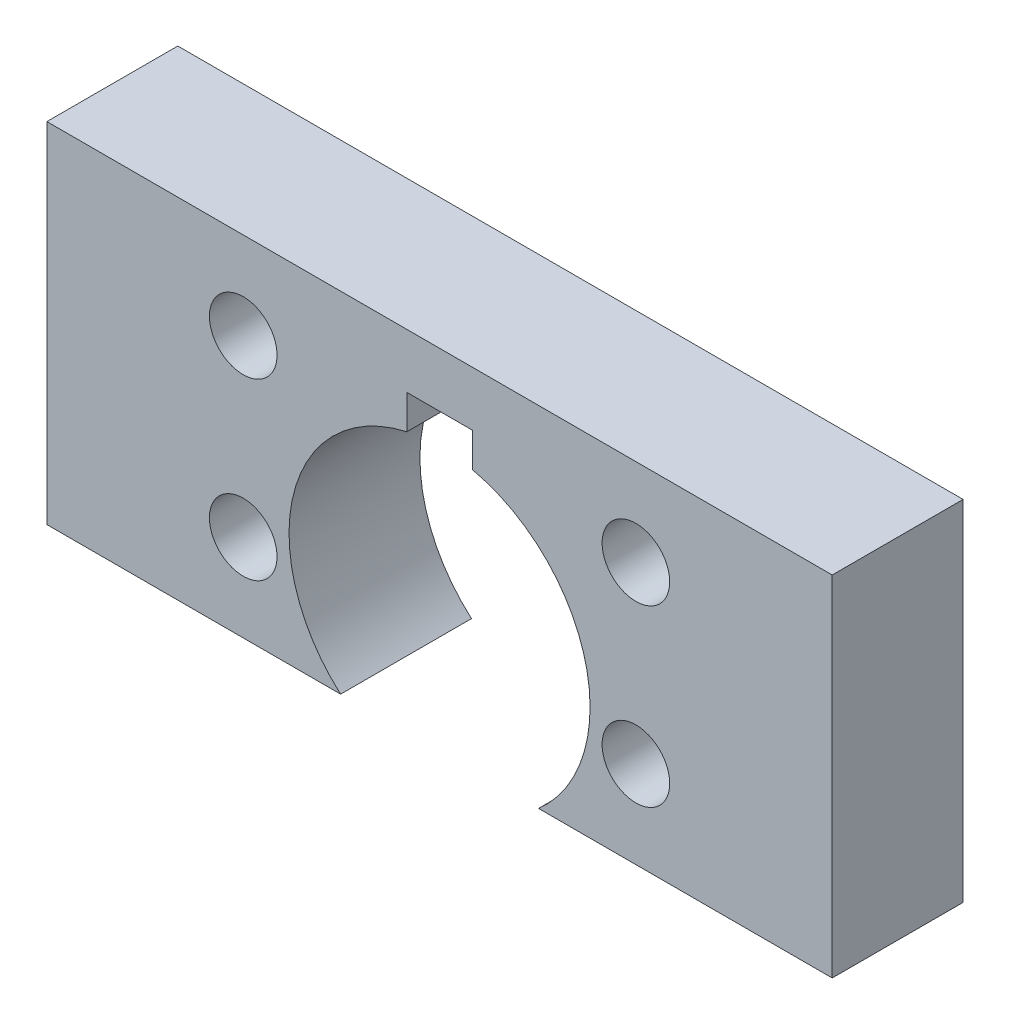
ISO-10303-21;
HEADER;
FILE_DESCRIPTION(('STEP AP214'),'2;1');
FILE_NAME('part.step','',(''),(''),'','','');
FILE_SCHEMA(('AUTOMOTIVE_DESIGN { 1 0 10303 214 1 1 1 1 }'));
ENDSEC;
DATA;
#1=APPLICATION_CONTEXT('core data for automotive mechanical design processes');
#2=APPLICATION_PROTOCOL_DEFINITION('international standard','automotive_design',2000,#1);
#3=PRODUCT_CONTEXT('',#1,'mechanical');
#4=PRODUCT('Part','Part','',(#3));
#5=PRODUCT_RELATED_PRODUCT_CATEGORY('part','',(#4));
#6=PRODUCT_DEFINITION_FORMATION('','',#4);
#7=PRODUCT_DEFINITION_CONTEXT('part definition',#1,'design');
#8=PRODUCT_DEFINITION('design','',#6,#7);
#9=PRODUCT_DEFINITION_SHAPE('','',#8);
#10=(LENGTH_UNIT() NAMED_UNIT(*) SI_UNIT(.MILLI.,.METRE.));
#11=(NAMED_UNIT(*) PLANE_ANGLE_UNIT() SI_UNIT($,.RADIAN.));
#12=(NAMED_UNIT(*) SI_UNIT($,.STERADIAN.) SOLID_ANGLE_UNIT());
#13=UNCERTAINTY_MEASURE_WITH_UNIT(LENGTH_MEASURE(1.E-05),#10,'distance_accuracy_value','');
#14=(GEOMETRIC_REPRESENTATION_CONTEXT(3) GLOBAL_UNCERTAINTY_ASSIGNED_CONTEXT((#13)) GLOBAL_UNIT_ASSIGNED_CONTEXT((#10,
#11,#12)) REPRESENTATION_CONTEXT('',''));
#15=CARTESIAN_POINT('',(0.,0.,0.));
#16=DIRECTION('',(0.,0.,1.));
#17=DIRECTION('',(1.,0.,0.));
#18=AXIS2_PLACEMENT_3D('',#15,#16,#17);
#19=CARTESIAN_POINT('',(71.5029820344726,-16.,-6.));
#20=DIRECTION('',(0.,-1.,0.));
#21=DIRECTION('',(0.,0.,-1.));
#22=AXIS2_PLACEMENT_3D('',#19,#20,#21);
#23=PLANE('',#22);
#24=DIRECTION('',(0.,0.,1.));
#25=VECTOR('',#24,1.);
#26=CARTESIAN_POINT('',(58.038398222652,-16.,-6.));
#27=LINE('',#26,#25);
#28=CARTESIAN_POINT('',(58.038398222652,-16.,-6.));
#29=VERTEX_POINT('',#28);
#30=CARTESIAN_POINT('',(58.038398222652,-16.,0.));
#31=VERTEX_POINT('',#30);
#32=EDGE_CURVE('E53',#29,#31,#27,.T.);
#33=ORIENTED_EDGE('',*,*,#32,.F.);
#34=DIRECTION('',(1.,0.,0.));
#35=VECTOR('',#34,1.);
#36=CARTESIAN_POINT('',(71.5029820344726,-16.,-6.));
#37=LINE('',#36,#35);
#38=CARTESIAN_POINT('',(71.5029820344726,-16.,-6.));
#39=VERTEX_POINT('',#38);
#40=EDGE_CURVE('E60',#29,#39,#37,.T.);
#41=ORIENTED_EDGE('',*,*,#40,.T.);
#42=DIRECTION('',(0.,0.,1.));
#43=VECTOR('',#42,1.);
#44=CARTESIAN_POINT('',(71.5029820344726,-16.,-6.));
#45=LINE('',#44,#43);
#46=CARTESIAN_POINT('',(71.5029820344726,-16.,0.));
#47=VERTEX_POINT('',#46);
#48=EDGE_CURVE('E46',#39,#47,#45,.T.);
#49=ORIENTED_EDGE('',*,*,#48,.T.);
#50=DIRECTION('',(1.,0.,0.));
#51=VECTOR('',#50,1.);
#52=CARTESIAN_POINT('',(71.5029820344726,-16.,0.));
#53=LINE('',#52,#51);
#54=EDGE_CURVE('E83',#31,#47,#53,.T.);
#55=ORIENTED_EDGE('',*,*,#54,.F.);
#56=EDGE_LOOP('',(#33,#41,#49,#55));
#57=FACE_BOUND('',#56,.T.);
#58=ADVANCED_FACE('F38',(#57),#23,.T.);
#59=DIRECTION('',(0.,0.,1.));
#60=VECTOR('',#59,1.);
#61=CARTESIAN_POINT('',(48.9675658462931,-16.,-6.));
#62=LINE('',#61,#60);
#63=CARTESIAN_POINT('',(48.9675658462931,-16.,0.));
#64=VERTEX_POINT('',#63);
#65=CARTESIAN_POINT('',(48.9675658462931,-16.,-6.));
#66=VERTEX_POINT('',#65);
#67=EDGE_CURVE('E174',#64,#66,#62,.F.);
#68=ORIENTED_EDGE('',*,*,#67,.F.);
#69=CARTESIAN_POINT('',(35.5029820344726,-16.,0.));
#70=VERTEX_POINT('',#69);
#71=EDGE_CURVE('E181',#70,#64,#53,.T.);
#72=ORIENTED_EDGE('',*,*,#71,.F.);
#73=DIRECTION('',(0.,0.,1.));
#74=VECTOR('',#73,1.);
#75=CARTESIAN_POINT('',(35.5029820344726,-16.,-6.));
#76=LINE('',#75,#74);
#77=CARTESIAN_POINT('',(35.5029820344726,-16.,-6.));
#78=VERTEX_POINT('',#77);
#79=EDGE_CURVE('E202',#78,#70,#76,.T.);
#80=ORIENTED_EDGE('',*,*,#79,.F.);
#81=EDGE_CURVE('E187',#78,#66,#37,.T.);
#82=ORIENTED_EDGE('',*,*,#81,.T.);
#83=EDGE_LOOP('',(#68,#72,#80,#82));
#84=FACE_BOUND('',#83,.T.);
#85=ADVANCED_FACE('F230',(#84),#23,.T.);
#86=CARTESIAN_POINT('',(71.5029820344726,0.,-6.));
#87=DIRECTION('',(1.,0.,0.));
#88=DIRECTION('',(0.,0.,-1.));
#89=AXIS2_PLACEMENT_3D('',#86,#87,#88);
#90=PLANE('',#89);
#91=DIRECTION('',(0.,1.,0.));
#92=VECTOR('',#91,1.);
#93=CARTESIAN_POINT('',(71.5029820344726,0.,0.));
#94=LINE('',#93,#92);
#95=CARTESIAN_POINT('',(71.5029820344726,0.,0.));
#96=VERTEX_POINT('',#95);
#97=EDGE_CURVE('E176',#47,#96,#94,.T.);
#98=ORIENTED_EDGE('',*,*,#97,.F.);
#99=ORIENTED_EDGE('',*,*,#48,.F.);
#100=DIRECTION('',(0.,1.,0.));
#101=VECTOR('',#100,1.);
#102=CARTESIAN_POINT('',(71.5029820344726,0.,-6.));
#103=LINE('',#102,#101);
#104=CARTESIAN_POINT('',(71.5029820344726,0.,-6.));
#105=VERTEX_POINT('',#104);
#106=EDGE_CURVE('E177',#39,#105,#103,.T.);
#107=ORIENTED_EDGE('',*,*,#106,.T.);
#108=DIRECTION('',(0.,0.,1.));
#109=VECTOR('',#108,1.);
#110=CARTESIAN_POINT('',(71.5029820344726,0.,-6.));
#111=LINE('',#110,#109);
#112=EDGE_CURVE('E89',#105,#96,#111,.T.);
#113=ORIENTED_EDGE('',*,*,#112,.T.);
#114=EDGE_LOOP('',(#98,#99,#107,#113));
#115=FACE_BOUND('',#114,.T.);
#116=ADVANCED_FACE('F40',(#115),#90,.T.);
#117=CARTESIAN_POINT('',(35.5029820344726,0.,-6.));
#118=DIRECTION('',(-1.,0.,0.));
#119=DIRECTION('',(0.,0.,1.));
#120=AXIS2_PLACEMENT_3D('',#117,#118,#119);
#121=PLANE('',#120);
#122=DIRECTION('',(0.,-1.,0.));
#123=VECTOR('',#122,1.);
#124=CARTESIAN_POINT('',(35.5029820344726,0.,0.));
#125=LINE('',#124,#123);
#126=CARTESIAN_POINT('',(35.5029820344726,0.,0.));
#127=VERTEX_POINT('',#126);
#128=EDGE_CURVE('E196',#127,#70,#125,.T.);
#129=ORIENTED_EDGE('',*,*,#128,.F.);
#130=DIRECTION('',(0.,0.,1.));
#131=VECTOR('',#130,1.);
#132=CARTESIAN_POINT('',(35.5029820344726,0.,-6.));
#133=LINE('',#132,#131);
#134=CARTESIAN_POINT('',(35.5029820344726,0.,-6.));
#135=VERTEX_POINT('',#134);
#136=EDGE_CURVE('E204',#135,#127,#133,.T.);
#137=ORIENTED_EDGE('',*,*,#136,.F.);
#138=DIRECTION('',(0.,-1.,0.));
#139=VECTOR('',#138,1.);
#140=CARTESIAN_POINT('',(35.5029820344726,0.,-6.));
#141=LINE('',#140,#139);
#142=EDGE_CURVE('E184',#135,#78,#141,.T.);
#143=ORIENTED_EDGE('',*,*,#142,.T.);
#144=ORIENTED_EDGE('',*,*,#79,.T.);
#145=EDGE_LOOP('',(#129,#137,#143,#144));
#146=FACE_BOUND('',#145,.T.);
#147=ADVANCED_FACE('F236',(#146),#121,.T.);
#148=CARTESIAN_POINT('',(71.5029820344726,0.,-6.));
#149=DIRECTION('',(0.,1.,0.));
#150=DIRECTION('',(-1.,0.,0.));
#151=AXIS2_PLACEMENT_3D('',#148,#149,#150);
#152=PLANE('',#151);
#153=DIRECTION('',(-1.,0.,0.));
#154=VECTOR('',#153,1.);
#155=CARTESIAN_POINT('',(71.5029820344726,0.,0.));
#156=LINE('',#155,#154);
#157=EDGE_CURVE('E192',#96,#127,#156,.T.);
#158=ORIENTED_EDGE('',*,*,#157,.F.);
#159=ORIENTED_EDGE('',*,*,#112,.F.);
#160=DIRECTION('',(-1.,0.,0.));
#161=VECTOR('',#160,1.);
#162=CARTESIAN_POINT('',(71.5029820344726,0.,-6.));
#163=LINE('',#162,#161);
#164=EDGE_CURVE('E180',#105,#135,#163,.T.);
#165=ORIENTED_EDGE('',*,*,#164,.T.);
#166=ORIENTED_EDGE('',*,*,#136,.T.);
#167=EDGE_LOOP('',(#158,#159,#165,#166));
#168=FACE_BOUND('',#167,.T.);
#169=ADVANCED_FACE('F208',(#168),#152,.T.);
#170=CARTESIAN_POINT('',(0.,0.,-6.));
#171=DIRECTION('',(0.,0.,-1.));
#172=DIRECTION('',(-1.,0.,0.));
#173=AXIS2_PLACEMENT_3D('',#170,#171,#172);
#174=PLANE('',#173);
#175=CARTESIAN_POINT('',(62.5029820345041,-11.999999999986,-6.));
#176=DIRECTION('',(0.,0.,-1.));
#177=DIRECTION('',(-1.,0.,0.));
#178=AXIS2_PLACEMENT_3D('',#175,#176,#177);
#179=CIRCLE('',#178,1.55000000002629);
#180=CARTESIAN_POINT('',(60.9529820344778,-11.999999999986,-6.));
#181=VERTEX_POINT('',#180);
#182=EDGE_CURVE('E372',#181,#181,#179,.T.);
#183=ORIENTED_EDGE('',*,*,#182,.F.);
#184=EDGE_LOOP('',(#183));
#185=FACE_BOUND('',#184,.T.);
#186=CARTESIAN_POINT('',(62.5029820345041,-3.99999999998596,-6.));
#187=DIRECTION('',(0.,0.,-1.));
#188=DIRECTION('',(-1.,0.,0.));
#189=AXIS2_PLACEMENT_3D('',#186,#187,#188);
#190=CIRCLE('',#189,1.55000000002629);
#191=CARTESIAN_POINT('',(60.9529820344778,-3.99999999998596,-6.));
#192=VERTEX_POINT('',#191);
#193=EDGE_CURVE('E374',#192,#192,#190,.T.);
#194=ORIENTED_EDGE('',*,*,#193,.F.);
#195=EDGE_LOOP('',(#194));
#196=FACE_BOUND('',#195,.T.);
#197=CARTESIAN_POINT('',(44.5029820345041,-3.99999999998596,-6.));
#198=DIRECTION('',(0.,0.,-1.));
#199=DIRECTION('',(-1.,0.,0.));
#200=AXIS2_PLACEMENT_3D('',#197,#198,#199);
#201=CIRCLE('',#200,1.55000000001517);
#202=CARTESIAN_POINT('',(42.952982034489,-3.99999999998596,-6.));
#203=VERTEX_POINT('',#202);
#204=EDGE_CURVE('E380',#203,#203,#201,.T.);
#205=ORIENTED_EDGE('',*,*,#204,.F.);
#206=EDGE_LOOP('',(#205));
#207=FACE_BOUND('',#206,.T.);
#208=CARTESIAN_POINT('',(44.5029820345041,-11.999999999986,-6.));
#209=DIRECTION('',(0.,0.,-1.));
#210=DIRECTION('',(-1.,0.,0.));
#211=AXIS2_PLACEMENT_3D('',#208,#209,#210);
#212=CIRCLE('',#211,1.5500000000263);
#213=CARTESIAN_POINT('',(42.9529820344778,-11.999999999986,-6.));
#214=VERTEX_POINT('',#213);
#215=EDGE_CURVE('E386',#214,#214,#212,.T.);
#216=ORIENTED_EDGE('',*,*,#215,.F.);
#217=EDGE_LOOP('',(#216));
#218=FACE_BOUND('',#217,.T.);
#219=CARTESIAN_POINT('',(53.5029820344726,-10.8,-6.));
#220=DIRECTION('',(0.,0.,1.));
#221=DIRECTION('',(1.,0.,0.));
#222=AXIS2_PLACEMENT_3D('',#219,#220,#221);
#223=CIRCLE('',#222,6.9);
#224=CARTESIAN_POINT('',(52.0029820344726,-4.06501670380691,-6.));
#225=VERTEX_POINT('',#224);
#226=EDGE_CURVE('E146',#225,#66,#223,.T.);
#227=ORIENTED_EDGE('',*,*,#226,.T.);
#228=ORIENTED_EDGE('',*,*,#81,.F.);
#229=ORIENTED_EDGE('',*,*,#142,.F.);
#230=ORIENTED_EDGE('',*,*,#164,.F.);
#231=ORIENTED_EDGE('',*,*,#106,.F.);
#232=ORIENTED_EDGE('',*,*,#40,.F.);
#233=CARTESIAN_POINT('',(53.5029820344726,-10.8,-6.));
#234=DIRECTION('',(0.,0.,1.));
#235=DIRECTION('',(1.,0.,0.));
#236=AXIS2_PLACEMENT_3D('',#233,#234,#235);
#237=CIRCLE('',#236,6.9);
#238=CARTESIAN_POINT('',(55.0029820344726,-4.06501670380691,-6.));
#239=VERTEX_POINT('',#238);
#240=EDGE_CURVE('E128',#29,#239,#237,.T.);
#241=ORIENTED_EDGE('',*,*,#240,.T.);
#242=DIRECTION('',(0.,1.,0.));
#243=VECTOR('',#242,1.);
#244=CARTESIAN_POINT('',(55.0029820344726,-4.06501670380691,-6.));
#245=LINE('',#244,#243);
#246=CARTESIAN_POINT('',(55.0029820344726,-2.5,-6.));
#247=VERTEX_POINT('',#246);
#248=EDGE_CURVE('E136',#239,#247,#245,.T.);
#249=ORIENTED_EDGE('',*,*,#248,.T.);
#250=DIRECTION('',(-1.,0.,0.));
#251=VECTOR('',#250,1.);
#252=CARTESIAN_POINT('',(55.0029820344726,-2.5,-6.));
#253=LINE('',#252,#251);
#254=CARTESIAN_POINT('',(52.0029820344726,-2.5,-6.));
#255=VERTEX_POINT('',#254);
#256=EDGE_CURVE('E141',#247,#255,#253,.T.);
#257=ORIENTED_EDGE('',*,*,#256,.T.);
#258=DIRECTION('',(0.,-1.,0.));
#259=VECTOR('',#258,1.);
#260=CARTESIAN_POINT('',(52.0029820344726,-4.06501670380691,-6.));
#261=LINE('',#260,#259);
#262=EDGE_CURVE('E133',#255,#225,#261,.T.);
#263=ORIENTED_EDGE('',*,*,#262,.T.);
#264=EDGE_LOOP('',(#227,#228,#229,#230,#231,#232,#241,#249,#257,#263));
#265=FACE_BOUND('',#264,.T.);
#266=ADVANCED_FACE('F144',(#185,#196,#207,#218,#265),#174,.T.);
#267=CARTESIAN_POINT('',(0.,0.,0.));
#268=DIRECTION('',(0.,0.,-1.));
#269=DIRECTION('',(-1.,0.,0.));
#270=AXIS2_PLACEMENT_3D('',#267,#268,#269);
#271=PLANE('',#270);
#272=CARTESIAN_POINT('',(62.5029820345041,-11.999999999986,0.));
#273=DIRECTION('',(0.,0.,-1.));
#274=DIRECTION('',(-1.,0.,0.));
#275=AXIS2_PLACEMENT_3D('',#272,#273,#274);
#276=CIRCLE('',#275,1.55000000002629);
#277=CARTESIAN_POINT('',(60.9529820344778,-11.999999999986,0.));
#278=VERTEX_POINT('',#277);
#279=EDGE_CURVE('E369',#278,#278,#276,.T.);
#280=ORIENTED_EDGE('',*,*,#279,.T.);
#281=EDGE_LOOP('',(#280));
#282=FACE_BOUND('',#281,.T.);
#283=CARTESIAN_POINT('',(62.5029820345041,-3.99999999998596,0.));
#284=DIRECTION('',(0.,0.,-1.));
#285=DIRECTION('',(-1.,0.,0.));
#286=AXIS2_PLACEMENT_3D('',#283,#284,#285);
#287=CIRCLE('',#286,1.55000000002629);
#288=CARTESIAN_POINT('',(60.9529820344778,-3.99999999998596,0.));
#289=VERTEX_POINT('',#288);
#290=EDGE_CURVE('E377',#289,#289,#287,.T.);
#291=ORIENTED_EDGE('',*,*,#290,.T.);
#292=EDGE_LOOP('',(#291));
#293=FACE_BOUND('',#292,.T.);
#294=CARTESIAN_POINT('',(44.5029820345041,-3.99999999998596,0.));
#295=DIRECTION('',(0.,0.,-1.));
#296=DIRECTION('',(-1.,0.,0.));
#297=AXIS2_PLACEMENT_3D('',#294,#295,#296);
#298=CIRCLE('',#297,1.55000000001517);
#299=CARTESIAN_POINT('',(42.952982034489,-3.99999999998596,0.));
#300=VERTEX_POINT('',#299);
#301=EDGE_CURVE('E383',#300,#300,#298,.T.);
#302=ORIENTED_EDGE('',*,*,#301,.T.);
#303=EDGE_LOOP('',(#302));
#304=FACE_BOUND('',#303,.T.);
#305=CARTESIAN_POINT('',(44.5029820345041,-11.999999999986,0.));
#306=DIRECTION('',(0.,0.,-1.));
#307=DIRECTION('',(-1.,0.,0.));
#308=AXIS2_PLACEMENT_3D('',#305,#306,#307);
#309=CIRCLE('',#308,1.5500000000263);
#310=CARTESIAN_POINT('',(42.9529820344778,-11.999999999986,0.));
#311=VERTEX_POINT('',#310);
#312=EDGE_CURVE('E158',#311,#311,#309,.T.);
#313=ORIENTED_EDGE('',*,*,#312,.T.);
#314=EDGE_LOOP('',(#313));
#315=FACE_BOUND('',#314,.T.);
#316=ORIENTED_EDGE('',*,*,#71,.T.);
#317=CARTESIAN_POINT('',(53.5029820344726,-10.8,0.));
#318=DIRECTION('',(0.,0.,1.));
#319=DIRECTION('',(1.,0.,0.));
#320=AXIS2_PLACEMENT_3D('',#317,#318,#319);
#321=CIRCLE('',#320,6.9);
#322=CARTESIAN_POINT('',(52.0029820344726,-4.06501670380691,0.));
#323=VERTEX_POINT('',#322);
#324=EDGE_CURVE('E155',#323,#64,#321,.T.);
#325=ORIENTED_EDGE('',*,*,#324,.F.);
#326=DIRECTION('',(0.,-1.,0.));
#327=VECTOR('',#326,1.);
#328=CARTESIAN_POINT('',(52.0029820344726,-4.06501670380691,0.));
#329=LINE('',#328,#327);
#330=CARTESIAN_POINT('',(52.0029820344726,-2.5,0.));
#331=VERTEX_POINT('',#330);
#332=EDGE_CURVE('E148',#331,#323,#329,.T.);
#333=ORIENTED_EDGE('',*,*,#332,.F.);
#334=DIRECTION('',(-1.,0.,0.));
#335=VECTOR('',#334,1.);
#336=CARTESIAN_POINT('',(55.0029820344726,-2.5,0.));
#337=LINE('',#336,#335);
#338=CARTESIAN_POINT('',(55.0029820344726,-2.5,0.));
#339=VERTEX_POINT('',#338);
#340=EDGE_CURVE('E161',#339,#331,#337,.T.);
#341=ORIENTED_EDGE('',*,*,#340,.F.);
#342=DIRECTION('',(0.,1.,0.));
#343=VECTOR('',#342,1.);
#344=CARTESIAN_POINT('',(55.0029820344726,-4.06501670380691,0.));
#345=LINE('',#344,#343);
#346=CARTESIAN_POINT('',(55.0029820344726,-4.06501670380691,0.));
#347=VERTEX_POINT('',#346);
#348=EDGE_CURVE('E157',#347,#339,#345,.T.);
#349=ORIENTED_EDGE('',*,*,#348,.F.);
#350=CARTESIAN_POINT('',(53.5029820344726,-10.8,0.));
#351=DIRECTION('',(0.,0.,-1.));
#352=DIRECTION('',(-1.,0.,0.));
#353=AXIS2_PLACEMENT_3D('',#350,#351,#352);
#354=CIRCLE('',#353,6.9);
#355=EDGE_CURVE('E11',#347,#31,#354,.T.);
#356=ORIENTED_EDGE('',*,*,#355,.T.);
#357=ORIENTED_EDGE('',*,*,#54,.T.);
#358=ORIENTED_EDGE('',*,*,#97,.T.);
#359=ORIENTED_EDGE('',*,*,#157,.T.);
#360=ORIENTED_EDGE('',*,*,#128,.T.);
#361=EDGE_LOOP('',(#316,#325,#333,#341,#349,#356,#357,#358,#359,#360));
#362=FACE_BOUND('',#361,.T.);
#363=ADVANCED_FACE('F210',(#282,#293,#304,#315,#362),#271,.F.);
#364=CARTESIAN_POINT('',(53.5029820344726,-10.8,-6.));
#365=DIRECTION('',(0.,0.,1.));
#366=DIRECTION('',(1.,0.,0.));
#367=AXIS2_PLACEMENT_3D('',#364,#365,#366);
#368=CYLINDRICAL_SURFACE('',#367,6.9);
#369=ORIENTED_EDGE('',*,*,#67,.T.);
#370=ORIENTED_EDGE('',*,*,#226,.F.);
#371=DIRECTION('',(0.,0.,1.));
#372=VECTOR('',#371,1.);
#373=CARTESIAN_POINT('',(52.0029820344726,-4.06501670380691,-6.));
#374=LINE('',#373,#372);
#375=EDGE_CURVE('E167',#225,#323,#374,.T.);
#376=ORIENTED_EDGE('',*,*,#375,.T.);
#377=ORIENTED_EDGE('',*,*,#324,.T.);
#378=EDGE_LOOP('',(#369,#370,#376,#377));
#379=FACE_BOUND('',#378,.T.);
#380=ADVANCED_FACE('F214',(#379),#368,.F.);
#381=CARTESIAN_POINT('',(52.0029820344726,-4.06501670380691,-6.));
#382=DIRECTION('',(-1.,0.,0.));
#383=DIRECTION('',(0.,0.,1.));
#384=AXIS2_PLACEMENT_3D('',#381,#382,#383);
#385=PLANE('',#384);
#386=ORIENTED_EDGE('',*,*,#332,.T.);
#387=ORIENTED_EDGE('',*,*,#375,.F.);
#388=ORIENTED_EDGE('',*,*,#262,.F.);
#389=DIRECTION('',(0.,0.,1.));
#390=VECTOR('',#389,1.);
#391=CARTESIAN_POINT('',(52.0029820344726,-2.5,-6.));
#392=LINE('',#391,#390);
#393=EDGE_CURVE('E169',#255,#331,#392,.T.);
#394=ORIENTED_EDGE('',*,*,#393,.T.);
#395=EDGE_LOOP('',(#386,#387,#388,#394));
#396=FACE_BOUND('',#395,.T.);
#397=ADVANCED_FACE('F221',(#396),#385,.F.);
#398=CARTESIAN_POINT('',(55.0029820344726,-2.5,-6.));
#399=DIRECTION('',(0.,1.,0.));
#400=DIRECTION('',(-1.,0.,0.));
#401=AXIS2_PLACEMENT_3D('',#398,#399,#400);
#402=PLANE('',#401);
#403=ORIENTED_EDGE('',*,*,#340,.T.);
#404=ORIENTED_EDGE('',*,*,#393,.F.);
#405=ORIENTED_EDGE('',*,*,#256,.F.);
#406=DIRECTION('',(0.,0.,1.));
#407=VECTOR('',#406,1.);
#408=CARTESIAN_POINT('',(55.0029820344726,-2.5,-6.));
#409=LINE('',#408,#407);
#410=EDGE_CURVE('E132',#247,#339,#409,.T.);
#411=ORIENTED_EDGE('',*,*,#410,.T.);
#412=EDGE_LOOP('',(#403,#404,#405,#411));
#413=FACE_BOUND('',#412,.T.);
#414=ADVANCED_FACE('F308',(#413),#402,.F.);
#415=CARTESIAN_POINT('',(55.0029820344726,-4.06501670380691,-6.));
#416=DIRECTION('',(1.,0.,0.));
#417=DIRECTION('',(0.,0.,-1.));
#418=AXIS2_PLACEMENT_3D('',#415,#416,#417);
#419=PLANE('',#418);
#420=ORIENTED_EDGE('',*,*,#348,.T.);
#421=ORIENTED_EDGE('',*,*,#410,.F.);
#422=ORIENTED_EDGE('',*,*,#248,.F.);
#423=DIRECTION('',(0.,0.,1.));
#424=VECTOR('',#423,1.);
#425=CARTESIAN_POINT('',(55.0029820344726,-4.06501670380691,-6.));
#426=LINE('',#425,#424);
#427=EDGE_CURVE('E124',#239,#347,#426,.T.);
#428=ORIENTED_EDGE('',*,*,#427,.T.);
#429=EDGE_LOOP('',(#420,#421,#422,#428));
#430=FACE_BOUND('',#429,.T.);
#431=ADVANCED_FACE('F137',(#430),#419,.F.);
#432=CARTESIAN_POINT('',(53.5029820344726,-10.8,-6.));
#433=DIRECTION('',(0.,0.,1.));
#434=DIRECTION('',(1.,0.,0.));
#435=AXIS2_PLACEMENT_3D('',#432,#433,#434);
#436=CYLINDRICAL_SURFACE('',#435,6.9);
#437=ORIENTED_EDGE('',*,*,#32,.T.);
#438=ORIENTED_EDGE('',*,*,#355,.F.);
#439=ORIENTED_EDGE('',*,*,#427,.F.);
#440=ORIENTED_EDGE('',*,*,#240,.F.);
#441=EDGE_LOOP('',(#437,#438,#439,#440));
#442=FACE_BOUND('',#441,.T.);
#443=ADVANCED_FACE('F126',(#442),#436,.F.);
#444=CARTESIAN_POINT('',(44.5029820345041,-11.999999999986,0.));
#445=DIRECTION('',(0.,0.,-1.));
#446=DIRECTION('',(-1.,0.,0.));
#447=AXIS2_PLACEMENT_3D('',#444,#445,#446);
#448=CYLINDRICAL_SURFACE('',#447,1.5500000000263);
#449=ORIENTED_EDGE('',*,*,#312,.F.);
#450=EDGE_LOOP('',(#449));
#451=FACE_BOUND('',#450,.T.);
#452=ORIENTED_EDGE('',*,*,#215,.T.);
#453=EDGE_LOOP('',(#452));
#454=FACE_BOUND('',#453,.T.);
#455=ADVANCED_FACE('F264',(#451,#454),#448,.F.);
#456=CARTESIAN_POINT('',(44.5029820345041,-3.99999999998596,0.));
#457=DIRECTION('',(0.,0.,-1.));
#458=DIRECTION('',(-1.,0.,0.));
#459=AXIS2_PLACEMENT_3D('',#456,#457,#458);
#460=CYLINDRICAL_SURFACE('',#459,1.55000000001517);
#461=ORIENTED_EDGE('',*,*,#301,.F.);
#462=EDGE_LOOP('',(#461));
#463=FACE_BOUND('',#462,.T.);
#464=ORIENTED_EDGE('',*,*,#204,.T.);
#465=EDGE_LOOP('',(#464));
#466=FACE_BOUND('',#465,.T.);
#467=ADVANCED_FACE('F269',(#463,#466),#460,.F.);
#468=CARTESIAN_POINT('',(62.5029820345041,-3.99999999998596,0.));
#469=DIRECTION('',(0.,0.,-1.));
#470=DIRECTION('',(-1.,0.,0.));
#471=AXIS2_PLACEMENT_3D('',#468,#469,#470);
#472=CYLINDRICAL_SURFACE('',#471,1.55000000002629);
#473=ORIENTED_EDGE('',*,*,#290,.F.);
#474=EDGE_LOOP('',(#473));
#475=FACE_BOUND('',#474,.T.);
#476=ORIENTED_EDGE('',*,*,#193,.T.);
#477=EDGE_LOOP('',(#476));
#478=FACE_BOUND('',#477,.T.);
#479=ADVANCED_FACE('F279',(#475,#478),#472,.F.);
#480=CARTESIAN_POINT('',(62.5029820345041,-11.999999999986,0.));
#481=DIRECTION('',(0.,0.,-1.));
#482=DIRECTION('',(-1.,0.,0.));
#483=AXIS2_PLACEMENT_3D('',#480,#481,#482);
#484=CYLINDRICAL_SURFACE('',#483,1.55000000002629);
#485=ORIENTED_EDGE('',*,*,#279,.F.);
#486=EDGE_LOOP('',(#485));
#487=FACE_BOUND('',#486,.T.);
#488=ORIENTED_EDGE('',*,*,#182,.T.);
#489=EDGE_LOOP('',(#488));
#490=FACE_BOUND('',#489,.T.);
#491=ADVANCED_FACE('F289',(#487,#490),#484,.F.);
#492=CLOSED_SHELL('',(#58,#85,#116,#147,#169,#266,#363,#380,#397,#414,#431,#443,#455,#467,#479,#491));
#493=MANIFOLD_SOLID_BREP('B2',#492);
#494=ADVANCED_BREP_SHAPE_REPRESENTATION('',(#18,#493),#14);
#495=SHAPE_DEFINITION_REPRESENTATION(#9,#494);
ENDSEC;
END-ISO-10303-21;
